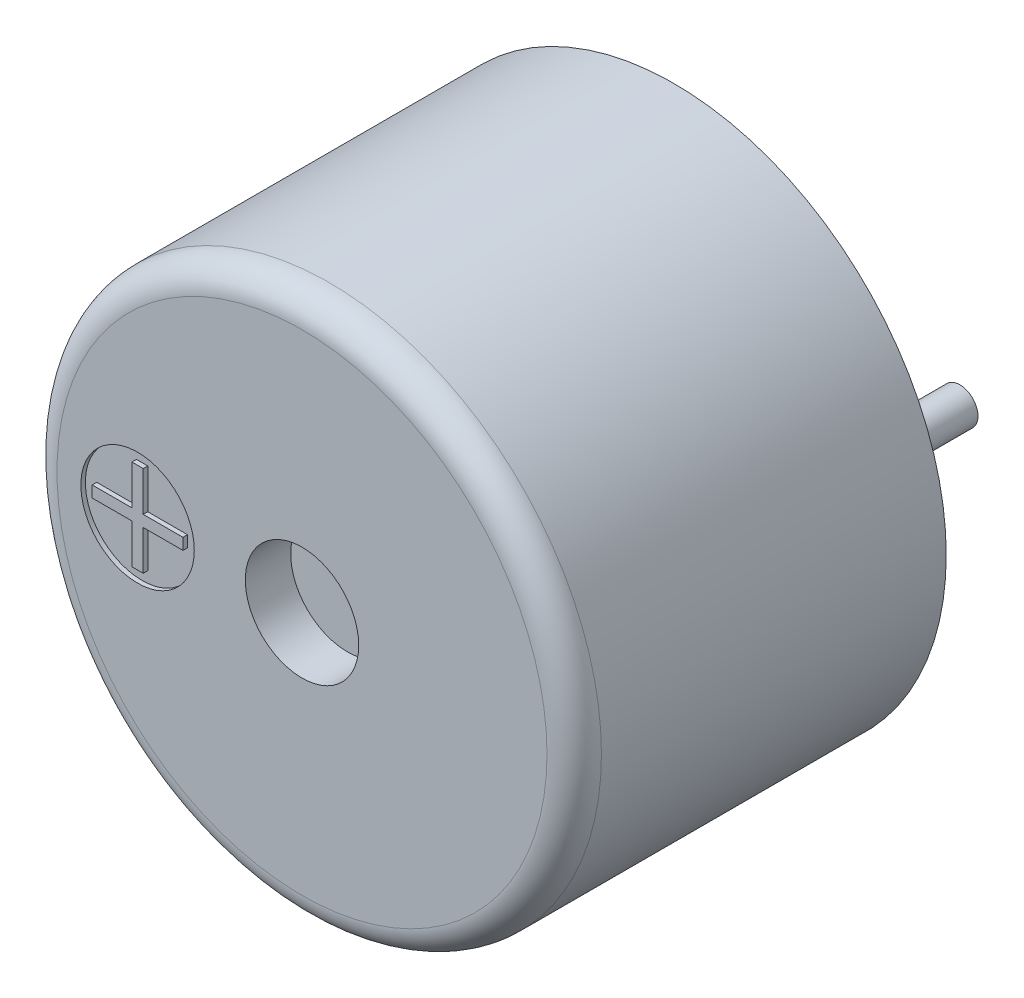
ISO-10303-21;
HEADER;
FILE_DESCRIPTION(('STEP AP214'),'2;1');
FILE_NAME('part.step','',(''),(''),'','','');
FILE_SCHEMA(('AUTOMOTIVE_DESIGN { 1 0 10303 214 1 1 1 1 }'));
ENDSEC;
DATA;
#1=APPLICATION_CONTEXT('core data for automotive mechanical design processes');
#2=APPLICATION_PROTOCOL_DEFINITION('international standard','automotive_design',2000,#1);
#3=PRODUCT_CONTEXT('',#1,'mechanical');
#4=PRODUCT('Part','Part','',(#3));
#5=PRODUCT_RELATED_PRODUCT_CATEGORY('part','',(#4));
#6=PRODUCT_DEFINITION_FORMATION('','',#4);
#7=PRODUCT_DEFINITION_CONTEXT('part definition',#1,'design');
#8=PRODUCT_DEFINITION('design','',#6,#7);
#9=PRODUCT_DEFINITION_SHAPE('','',#8);
#10=(LENGTH_UNIT() NAMED_UNIT(*) SI_UNIT(.MILLI.,.METRE.));
#11=(NAMED_UNIT(*) PLANE_ANGLE_UNIT() SI_UNIT($,.RADIAN.));
#12=(NAMED_UNIT(*) SI_UNIT($,.STERADIAN.) SOLID_ANGLE_UNIT());
#13=UNCERTAINTY_MEASURE_WITH_UNIT(LENGTH_MEASURE(1.E-05),#10,'distance_accuracy_value','');
#14=(GEOMETRIC_REPRESENTATION_CONTEXT(3) GLOBAL_UNCERTAINTY_ASSIGNED_CONTEXT((#13)) GLOBAL_UNIT_ASSIGNED_CONTEXT((#10,
#11,#12)) REPRESENTATION_CONTEXT('',''));
#15=CARTESIAN_POINT('',(0.,0.,0.));
#16=DIRECTION('',(0.,0.,1.));
#17=DIRECTION('',(1.,0.,0.));
#18=AXIS2_PLACEMENT_3D('',#15,#16,#17);
#19=CARTESIAN_POINT('',(0.,0.,8.2));
#20=DIRECTION('',(0.,0.,-1.));
#21=DIRECTION('',(-1.,0.,0.));
#22=AXIS2_PLACEMENT_3D('',#19,#20,#21);
#23=CYLINDRICAL_SURFACE('',#22,6.);
#24=CARTESIAN_POINT('',(0.,0.,7.6));
#25=DIRECTION('',(0.,0.,1.));
#26=DIRECTION('',(1.,0.,0.));
#27=AXIS2_PLACEMENT_3D('',#24,#25,#26);
#28=CIRCLE('',#27,6.);
#29=CARTESIAN_POINT('',(6.,0.,7.6));
#30=VERTEX_POINT('',#29);
#31=EDGE_CURVE('E11',#30,#30,#28,.F.);
#32=ORIENTED_EDGE('',*,*,#31,.T.);
#33=EDGE_LOOP('',(#32));
#34=FACE_BOUND('',#33,.T.);
#35=CARTESIAN_POINT('',(0.,0.,0.));
#36=DIRECTION('',(0.,0.,1.));
#37=DIRECTION('',(1.,0.,0.));
#38=AXIS2_PLACEMENT_3D('',#35,#36,#37);
#39=CIRCLE('',#38,6.);
#40=CARTESIAN_POINT('',(6.,0.,0.));
#41=VERTEX_POINT('',#40);
#42=EDGE_CURVE('E250',#41,#41,#39,.T.);
#43=ORIENTED_EDGE('',*,*,#42,.T.);
#44=EDGE_LOOP('',(#43));
#45=FACE_BOUND('',#44,.T.);
#46=ADVANCED_FACE('F37',(#34,#45),#23,.T.);
#47=CARTESIAN_POINT('',(0.,0.,8.2));
#48=DIRECTION('',(0.,0.,1.));
#49=DIRECTION('',(1.,0.,0.));
#50=AXIS2_PLACEMENT_3D('',#47,#48,#49);
#51=PLANE('',#50);
#52=CARTESIAN_POINT('',(-3.625,0.,8.2));
#53=DIRECTION('',(0.,0.,1.));
#54=DIRECTION('',(1.,0.,0.));
#55=AXIS2_PLACEMENT_3D('',#52,#53,#54);
#56=CIRCLE('',#55,1.25);
#57=CARTESIAN_POINT('',(-2.375,0.,8.2));
#58=VERTEX_POINT('',#57);
#59=EDGE_CURVE('E209',#58,#58,#56,.T.);
#60=ORIENTED_EDGE('',*,*,#59,.F.);
#61=EDGE_LOOP('',(#60));
#62=FACE_BOUND('',#61,.T.);
#63=CARTESIAN_POINT('',(0.,0.,8.2));
#64=DIRECTION('',(0.,0.,1.));
#65=DIRECTION('',(1.,0.,0.));
#66=AXIS2_PLACEMENT_3D('',#63,#64,#65);
#67=CIRCLE('',#66,5.4);
#68=CARTESIAN_POINT('',(5.4,0.,8.2));
#69=VERTEX_POINT('',#68);
#70=EDGE_CURVE('E45',#69,#69,#67,.T.);
#71=ORIENTED_EDGE('',*,*,#70,.T.);
#72=EDGE_LOOP('',(#71));
#73=FACE_BOUND('',#72,.T.);
#74=CARTESIAN_POINT('',(0.,0.,8.2));
#75=DIRECTION('',(0.,0.,1.));
#76=DIRECTION('',(1.,0.,0.));
#77=AXIS2_PLACEMENT_3D('',#74,#75,#76);
#78=CIRCLE('',#77,1.25);
#79=CARTESIAN_POINT('',(1.25,0.,8.2));
#80=VERTEX_POINT('',#79);
#81=EDGE_CURVE('E244',#80,#80,#78,.T.);
#82=ORIENTED_EDGE('',*,*,#81,.F.);
#83=EDGE_LOOP('',(#82));
#84=FACE_BOUND('',#83,.T.);
#85=ADVANCED_FACE('F257',(#62,#73,#84),#51,.T.);
#86=CARTESIAN_POINT('',(0.,0.,0.));
#87=DIRECTION('',(0.,0.,1.));
#88=DIRECTION('',(1.,0.,0.));
#89=AXIS2_PLACEMENT_3D('',#86,#87,#88);
#90=PLANE('',#89);
#91=CARTESIAN_POINT('',(-3.3,0.,0.));
#92=DIRECTION('',(0.,0.,1.));
#93=DIRECTION('',(-1.,0.,0.));
#94=AXIS2_PLACEMENT_3D('',#91,#92,#93);
#95=CIRCLE('',#94,0.4);
#96=CARTESIAN_POINT('',(-3.7,0.,0.));
#97=VERTEX_POINT('',#96);
#98=EDGE_CURVE('E232',#97,#97,#95,.T.);
#99=ORIENTED_EDGE('',*,*,#98,.T.);
#100=EDGE_LOOP('',(#99));
#101=FACE_BOUND('',#100,.T.);
#102=CARTESIAN_POINT('',(3.3,0.,0.));
#103=DIRECTION('',(0.,0.,1.));
#104=DIRECTION('',(1.,0.,0.));
#105=AXIS2_PLACEMENT_3D('',#102,#103,#104);
#106=CIRCLE('',#105,0.4);
#107=CARTESIAN_POINT('',(3.7,0.,0.));
#108=VERTEX_POINT('',#107);
#109=EDGE_CURVE('E238',#108,#108,#106,.T.);
#110=ORIENTED_EDGE('',*,*,#109,.T.);
#111=EDGE_LOOP('',(#110));
#112=FACE_BOUND('',#111,.T.);
#113=ORIENTED_EDGE('',*,*,#42,.F.);
#114=EDGE_LOOP('',(#113));
#115=FACE_BOUND('',#114,.T.);
#116=ADVANCED_FACE('F279',(#101,#112,#115),#90,.F.);
#117=CARTESIAN_POINT('',(0.,0.,7.2));
#118=DIRECTION('',(0.,0.,1.));
#119=DIRECTION('',(1.,0.,0.));
#120=AXIS2_PLACEMENT_3D('',#117,#118,#119);
#121=CYLINDRICAL_SURFACE('',#120,1.25);
#122=CARTESIAN_POINT('',(0.,0.,7.2));
#123=DIRECTION('',(0.,0.,1.));
#124=DIRECTION('',(1.,0.,0.));
#125=AXIS2_PLACEMENT_3D('',#122,#123,#124);
#126=CIRCLE('',#125,1.25);
#127=CARTESIAN_POINT('',(1.25,0.,7.2));
#128=VERTEX_POINT('',#127);
#129=EDGE_CURVE('E247',#128,#128,#126,.T.);
#130=ORIENTED_EDGE('',*,*,#129,.F.);
#131=EDGE_LOOP('',(#130));
#132=FACE_BOUND('',#131,.T.);
#133=ORIENTED_EDGE('',*,*,#81,.T.);
#134=EDGE_LOOP('',(#133));
#135=FACE_BOUND('',#134,.T.);
#136=ADVANCED_FACE('F286',(#132,#135),#121,.F.);
#137=CARTESIAN_POINT('',(0.,0.,7.2));
#138=DIRECTION('',(0.,0.,1.));
#139=DIRECTION('',(1.,0.,0.));
#140=AXIS2_PLACEMENT_3D('',#137,#138,#139);
#141=PLANE('',#140);
#142=ORIENTED_EDGE('',*,*,#129,.T.);
#143=EDGE_LOOP('',(#142));
#144=FACE_BOUND('',#143,.T.);
#145=ADVANCED_FACE('F291',(#144),#141,.T.);
#146=CARTESIAN_POINT('',(3.3,0.,-3.));
#147=DIRECTION('',(0.,0.,1.));
#148=DIRECTION('',(1.,0.,0.));
#149=AXIS2_PLACEMENT_3D('',#146,#147,#148);
#150=CYLINDRICAL_SURFACE('',#149,0.4);
#151=CARTESIAN_POINT('',(3.3,0.,-3.));
#152=DIRECTION('',(0.,0.,1.));
#153=DIRECTION('',(1.,0.,0.));
#154=AXIS2_PLACEMENT_3D('',#151,#152,#153);
#155=CIRCLE('',#154,0.4);
#156=CARTESIAN_POINT('',(3.7,0.,-3.));
#157=VERTEX_POINT('',#156);
#158=EDGE_CURVE('E241',#157,#157,#155,.T.);
#159=ORIENTED_EDGE('',*,*,#158,.T.);
#160=EDGE_LOOP('',(#159));
#161=FACE_BOUND('',#160,.T.);
#162=ORIENTED_EDGE('',*,*,#109,.F.);
#163=EDGE_LOOP('',(#162));
#164=FACE_BOUND('',#163,.T.);
#165=ADVANCED_FACE('F295',(#161,#164),#150,.T.);
#166=CARTESIAN_POINT('',(3.3,0.,-3.));
#167=DIRECTION('',(0.,0.,1.));
#168=DIRECTION('',(1.,0.,0.));
#169=AXIS2_PLACEMENT_3D('',#166,#167,#168);
#170=PLANE('',#169);
#171=ORIENTED_EDGE('',*,*,#158,.F.);
#172=EDGE_LOOP('',(#171));
#173=FACE_BOUND('',#172,.T.);
#174=ADVANCED_FACE('F299',(#173),#170,.F.);
#175=CARTESIAN_POINT('',(-3.3,0.,-3.));
#176=DIRECTION('',(0.,0.,1.));
#177=DIRECTION('',(1.,0.,0.));
#178=AXIS2_PLACEMENT_3D('',#175,#176,#177);
#179=CYLINDRICAL_SURFACE('',#178,0.4);
#180=CARTESIAN_POINT('',(-3.3,0.,-3.));
#181=DIRECTION('',(0.,0.,1.));
#182=DIRECTION('',(-1.,0.,0.));
#183=AXIS2_PLACEMENT_3D('',#180,#181,#182);
#184=CIRCLE('',#183,0.4);
#185=CARTESIAN_POINT('',(-3.7,0.,-3.));
#186=VERTEX_POINT('',#185);
#187=EDGE_CURVE('E235',#186,#186,#184,.T.);
#188=ORIENTED_EDGE('',*,*,#187,.T.);
#189=EDGE_LOOP('',(#188));
#190=FACE_BOUND('',#189,.T.);
#191=ORIENTED_EDGE('',*,*,#98,.F.);
#192=EDGE_LOOP('',(#191));
#193=FACE_BOUND('',#192,.T.);
#194=ADVANCED_FACE('F270',(#190,#193),#179,.T.);
#195=CARTESIAN_POINT('',(-3.3,0.,-3.));
#196=DIRECTION('',(0.,0.,-1.));
#197=DIRECTION('',(-1.,0.,0.));
#198=AXIS2_PLACEMENT_3D('',#195,#196,#197);
#199=PLANE('',#198);
#200=ORIENTED_EDGE('',*,*,#187,.F.);
#201=EDGE_LOOP('',(#200));
#202=FACE_BOUND('',#201,.T.);
#203=ADVANCED_FACE('F262',(#202),#199,.T.);
#204=CARTESIAN_POINT('',(0.,0.,7.6));
#205=DIRECTION('',(0.,0.,1.));
#206=DIRECTION('',(1.,0.,0.));
#207=AXIS2_PLACEMENT_3D('',#204,#205,#206);
#208=TOROIDAL_SURFACE('',#207,5.4,0.6);
#209=ORIENTED_EDGE('',*,*,#31,.F.);
#210=EDGE_LOOP('',(#209));
#211=FACE_BOUND('',#210,.T.);
#212=ORIENTED_EDGE('',*,*,#70,.F.);
#213=EDGE_LOOP('',(#212));
#214=FACE_BOUND('',#213,.T.);
#215=ADVANCED_FACE('F39',(#211,#214),#208,.T.);
#216=CARTESIAN_POINT('',(-3.625,0.,8.1));
#217=DIRECTION('',(0.,0.,1.));
#218=DIRECTION('',(1.,0.,0.));
#219=AXIS2_PLACEMENT_3D('',#216,#217,#218);
#220=CYLINDRICAL_SURFACE('',#219,1.25);
#221=CARTESIAN_POINT('',(-3.625,0.,8.1));
#222=DIRECTION('',(0.,0.,1.));
#223=DIRECTION('',(1.,0.,0.));
#224=AXIS2_PLACEMENT_3D('',#221,#222,#223);
#225=CIRCLE('',#224,1.25);
#226=CARTESIAN_POINT('',(-2.375,0.,8.1));
#227=VERTEX_POINT('',#226);
#228=EDGE_CURVE('E229',#227,#227,#225,.T.);
#229=ORIENTED_EDGE('',*,*,#228,.F.);
#230=EDGE_LOOP('',(#229));
#231=FACE_BOUND('',#230,.T.);
#232=ORIENTED_EDGE('',*,*,#59,.T.);
#233=EDGE_LOOP('',(#232));
#234=FACE_BOUND('',#233,.T.);
#235=ADVANCED_FACE('F261',(#231,#234),#220,.F.);
#236=CARTESIAN_POINT('',(-3.625,0.,8.1));
#237=DIRECTION('',(0.,0.,1.));
#238=DIRECTION('',(1.,0.,0.));
#239=AXIS2_PLACEMENT_3D('',#236,#237,#238);
#240=PLANE('',#239);
#241=DIRECTION('',(0.,1.,0.));
#242=VECTOR('',#241,1.);
#243=CARTESIAN_POINT('',(-2.625,-0.125,8.1));
#244=LINE('',#243,#242);
#245=CARTESIAN_POINT('',(-2.625,-0.125,8.1));
#246=VERTEX_POINT('',#245);
#247=CARTESIAN_POINT('',(-2.625,0.125,8.1));
#248=VERTEX_POINT('',#247);
#249=EDGE_CURVE('E138',#246,#248,#244,.T.);
#250=ORIENTED_EDGE('',*,*,#249,.F.);
#251=DIRECTION('',(1.,0.,0.));
#252=VECTOR('',#251,1.);
#253=CARTESIAN_POINT('',(-2.625,-0.125,8.1));
#254=LINE('',#253,#252);
#255=CARTESIAN_POINT('',(-3.5,-0.125,8.1));
#256=VERTEX_POINT('',#255);
#257=EDGE_CURVE('E177',#256,#246,#254,.T.);
#258=ORIENTED_EDGE('',*,*,#257,.F.);
#259=DIRECTION('',(0.,1.,0.));
#260=VECTOR('',#259,1.);
#261=CARTESIAN_POINT('',(-3.5,-1.,8.1));
#262=LINE('',#261,#260);
#263=CARTESIAN_POINT('',(-3.5,-1.,8.1));
#264=VERTEX_POINT('',#263);
#265=EDGE_CURVE('E174',#264,#256,#262,.T.);
#266=ORIENTED_EDGE('',*,*,#265,.F.);
#267=DIRECTION('',(1.,0.,0.));
#268=VECTOR('',#267,1.);
#269=CARTESIAN_POINT('',(-3.75,-1.,8.1));
#270=LINE('',#269,#268);
#271=CARTESIAN_POINT('',(-3.75,-1.,8.1));
#272=VERTEX_POINT('',#271);
#273=EDGE_CURVE('E171',#272,#264,#270,.T.);
#274=ORIENTED_EDGE('',*,*,#273,.F.);
#275=DIRECTION('',(0.,-1.,0.));
#276=VECTOR('',#275,1.);
#277=CARTESIAN_POINT('',(-3.75,-1.,8.1));
#278=LINE('',#277,#276);
#279=CARTESIAN_POINT('',(-3.75,-0.125,8.1));
#280=VERTEX_POINT('',#279);
#281=EDGE_CURVE('E168',#280,#272,#278,.T.);
#282=ORIENTED_EDGE('',*,*,#281,.F.);
#283=DIRECTION('',(1.,0.,0.));
#284=VECTOR('',#283,1.);
#285=CARTESIAN_POINT('',(-4.625,-0.125,8.1));
#286=LINE('',#285,#284);
#287=CARTESIAN_POINT('',(-4.625,-0.125,8.1));
#288=VERTEX_POINT('',#287);
#289=EDGE_CURVE('E165',#288,#280,#286,.T.);
#290=ORIENTED_EDGE('',*,*,#289,.F.);
#291=DIRECTION('',(0.,-1.,0.));
#292=VECTOR('',#291,1.);
#293=CARTESIAN_POINT('',(-4.625,-0.125,8.1));
#294=LINE('',#293,#292);
#295=CARTESIAN_POINT('',(-4.625,0.125,8.1));
#296=VERTEX_POINT('',#295);
#297=EDGE_CURVE('E162',#296,#288,#294,.T.);
#298=ORIENTED_EDGE('',*,*,#297,.F.);
#299=DIRECTION('',(-1.,0.,0.));
#300=VECTOR('',#299,1.);
#301=CARTESIAN_POINT('',(-4.625,0.125,8.1));
#302=LINE('',#301,#300);
#303=CARTESIAN_POINT('',(-3.75,0.124999999999999,8.1));
#304=VERTEX_POINT('',#303);
#305=EDGE_CURVE('E159',#304,#296,#302,.T.);
#306=ORIENTED_EDGE('',*,*,#305,.F.);
#307=DIRECTION('',(0.,-1.,0.));
#308=VECTOR('',#307,1.);
#309=CARTESIAN_POINT('',(-3.75,1.,8.1));
#310=LINE('',#309,#308);
#311=CARTESIAN_POINT('',(-3.75,1.,8.1));
#312=VERTEX_POINT('',#311);
#313=EDGE_CURVE('E156',#312,#304,#310,.T.);
#314=ORIENTED_EDGE('',*,*,#313,.F.);
#315=DIRECTION('',(-1.,0.,0.));
#316=VECTOR('',#315,1.);
#317=CARTESIAN_POINT('',(-3.75,1.,8.1));
#318=LINE('',#317,#316);
#319=CARTESIAN_POINT('',(-3.5,1.,8.1));
#320=VERTEX_POINT('',#319);
#321=EDGE_CURVE('E60',#320,#312,#318,.T.);
#322=ORIENTED_EDGE('',*,*,#321,.F.);
#323=DIRECTION('',(0.,1.,0.));
#324=VECTOR('',#323,1.);
#325=CARTESIAN_POINT('',(-3.5,1.,8.1));
#326=LINE('',#325,#324);
#327=CARTESIAN_POINT('',(-3.5,0.124999999999999,8.1));
#328=VERTEX_POINT('',#327);
#329=EDGE_CURVE('E130',#328,#320,#326,.T.);
#330=ORIENTED_EDGE('',*,*,#329,.F.);
#331=DIRECTION('',(-1.,0.,0.));
#332=VECTOR('',#331,1.);
#333=CARTESIAN_POINT('',(-2.625,0.125,8.1));
#334=LINE('',#333,#332);
#335=EDGE_CURVE('E144',#248,#328,#334,.T.);
#336=ORIENTED_EDGE('',*,*,#335,.F.);
#337=EDGE_LOOP('',(#250,#258,#266,#274,#282,#290,#298,#306,#314,#322,#330,#336));
#338=FACE_BOUND('',#337,.T.);
#339=ORIENTED_EDGE('',*,*,#228,.T.);
#340=EDGE_LOOP('',(#339));
#341=FACE_BOUND('',#340,.T.);
#342=ADVANCED_FACE('F142',(#338,#341),#240,.T.);
#343=CARTESIAN_POINT('',(-2.625,0.125,8.1));
#344=DIRECTION('',(0.,1.,0.));
#345=DIRECTION('',(-1.,0.,0.));
#346=AXIS2_PLACEMENT_3D('',#343,#344,#345);
#347=PLANE('',#346);
#348=DIRECTION('',(-1.,0.,0.));
#349=VECTOR('',#348,1.);
#350=CARTESIAN_POINT('',(-2.625,0.125,8.2));
#351=LINE('',#350,#349);
#352=CARTESIAN_POINT('',(-2.625,0.125,8.2));
#353=VERTEX_POINT('',#352);
#354=CARTESIAN_POINT('',(-3.5,0.124999999999999,8.2));
#355=VERTEX_POINT('',#354);
#356=EDGE_CURVE('E181',#353,#355,#351,.T.);
#357=ORIENTED_EDGE('',*,*,#356,.F.);
#358=DIRECTION('',(0.,0.,1.));
#359=VECTOR('',#358,1.);
#360=CARTESIAN_POINT('',(-2.625,0.125,8.1));
#361=LINE('',#360,#359);
#362=EDGE_CURVE('E148',#248,#353,#361,.T.);
#363=ORIENTED_EDGE('',*,*,#362,.F.);
#364=ORIENTED_EDGE('',*,*,#335,.T.);
#365=DIRECTION('',(0.,0.,1.));
#366=VECTOR('',#365,1.);
#367=CARTESIAN_POINT('',(-3.5,0.124999999999999,8.1));
#368=LINE('',#367,#366);
#369=EDGE_CURVE('E128',#328,#355,#368,.T.);
#370=ORIENTED_EDGE('',*,*,#369,.T.);
#371=EDGE_LOOP('',(#357,#363,#364,#370));
#372=FACE_BOUND('',#371,.T.);
#373=ADVANCED_FACE('F147',(#372),#347,.T.);
#374=CARTESIAN_POINT('',(-2.625,-0.125,8.1));
#375=DIRECTION('',(1.,0.,0.));
#376=DIRECTION('',(0.,0.,-1.));
#377=AXIS2_PLACEMENT_3D('',#374,#375,#376);
#378=PLANE('',#377);
#379=DIRECTION('',(0.,1.,0.));
#380=VECTOR('',#379,1.);
#381=CARTESIAN_POINT('',(-2.625,-0.125,8.2));
#382=LINE('',#381,#380);
#383=CARTESIAN_POINT('',(-2.625,-0.125,8.2));
#384=VERTEX_POINT('',#383);
#385=EDGE_CURVE('E149',#384,#353,#382,.T.);
#386=ORIENTED_EDGE('',*,*,#385,.F.);
#387=DIRECTION('',(0.,0.,1.));
#388=VECTOR('',#387,1.);
#389=CARTESIAN_POINT('',(-2.625,-0.125,8.1));
#390=LINE('',#389,#388);
#391=EDGE_CURVE('E210',#246,#384,#390,.T.);
#392=ORIENTED_EDGE('',*,*,#391,.F.);
#393=ORIENTED_EDGE('',*,*,#249,.T.);
#394=ORIENTED_EDGE('',*,*,#362,.T.);
#395=EDGE_LOOP('',(#386,#392,#393,#394));
#396=FACE_BOUND('',#395,.T.);
#397=ADVANCED_FACE('F311',(#396),#378,.T.);
#398=CARTESIAN_POINT('',(-2.625,-0.125,8.1));
#399=DIRECTION('',(0.,-1.,0.));
#400=DIRECTION('',(1.,0.,0.));
#401=AXIS2_PLACEMENT_3D('',#398,#399,#400);
#402=PLANE('',#401);
#403=DIRECTION('',(1.,0.,0.));
#404=VECTOR('',#403,1.);
#405=CARTESIAN_POINT('',(-2.625,-0.125,8.2));
#406=LINE('',#405,#404);
#407=CARTESIAN_POINT('',(-3.5,-0.125,8.2));
#408=VERTEX_POINT('',#407);
#409=EDGE_CURVE('E152',#408,#384,#406,.T.);
#410=ORIENTED_EDGE('',*,*,#409,.F.);
#411=DIRECTION('',(0.,0.,1.));
#412=VECTOR('',#411,1.);
#413=CARTESIAN_POINT('',(-3.5,-0.125,8.1));
#414=LINE('',#413,#412);
#415=EDGE_CURVE('E212',#256,#408,#414,.T.);
#416=ORIENTED_EDGE('',*,*,#415,.F.);
#417=ORIENTED_EDGE('',*,*,#257,.T.);
#418=ORIENTED_EDGE('',*,*,#391,.T.);
#419=EDGE_LOOP('',(#410,#416,#417,#418));
#420=FACE_BOUND('',#419,.T.);
#421=ADVANCED_FACE('F344',(#420),#402,.T.);
#422=CARTESIAN_POINT('',(-3.5,-1.,8.1));
#423=DIRECTION('',(1.,0.,0.));
#424=DIRECTION('',(0.,1.,0.));
#425=AXIS2_PLACEMENT_3D('',#422,#423,#424);
#426=PLANE('',#425);
#427=DIRECTION('',(0.,1.,0.));
#428=VECTOR('',#427,1.);
#429=CARTESIAN_POINT('',(-3.5,-1.,8.2));
#430=LINE('',#429,#428);
#431=CARTESIAN_POINT('',(-3.5,-1.,8.2));
#432=VERTEX_POINT('',#431);
#433=EDGE_CURVE('E203',#432,#408,#430,.T.);
#434=ORIENTED_EDGE('',*,*,#433,.F.);
#435=DIRECTION('',(0.,0.,1.));
#436=VECTOR('',#435,1.);
#437=CARTESIAN_POINT('',(-3.5,-1.,8.1));
#438=LINE('',#437,#436);
#439=EDGE_CURVE('E214',#264,#432,#438,.T.);
#440=ORIENTED_EDGE('',*,*,#439,.F.);
#441=ORIENTED_EDGE('',*,*,#265,.T.);
#442=ORIENTED_EDGE('',*,*,#415,.T.);
#443=EDGE_LOOP('',(#434,#440,#441,#442));
#444=FACE_BOUND('',#443,.T.);
#445=ADVANCED_FACE('F340',(#444),#426,.T.);
#446=CARTESIAN_POINT('',(-3.75,-1.,8.1));
#447=DIRECTION('',(0.,-1.,0.));
#448=DIRECTION('',(0.,0.,-1.));
#449=AXIS2_PLACEMENT_3D('',#446,#447,#448);
#450=PLANE('',#449);
#451=DIRECTION('',(1.,0.,0.));
#452=VECTOR('',#451,1.);
#453=CARTESIAN_POINT('',(-3.75,-1.,8.2));
#454=LINE('',#453,#452);
#455=CARTESIAN_POINT('',(-3.75,-1.,8.2));
#456=VERTEX_POINT('',#455);
#457=EDGE_CURVE('E200',#456,#432,#454,.T.);
#458=ORIENTED_EDGE('',*,*,#457,.F.);
#459=DIRECTION('',(0.,0.,1.));
#460=VECTOR('',#459,1.);
#461=CARTESIAN_POINT('',(-3.75,-1.,8.1));
#462=LINE('',#461,#460);
#463=EDGE_CURVE('E216',#272,#456,#462,.T.);
#464=ORIENTED_EDGE('',*,*,#463,.F.);
#465=ORIENTED_EDGE('',*,*,#273,.T.);
#466=ORIENTED_EDGE('',*,*,#439,.T.);
#467=EDGE_LOOP('',(#458,#464,#465,#466));
#468=FACE_BOUND('',#467,.T.);
#469=ADVANCED_FACE('F336',(#468),#450,.T.);
#470=CARTESIAN_POINT('',(-3.75,-1.,8.1));
#471=DIRECTION('',(-1.,0.,0.));
#472=DIRECTION('',(0.,-1.,0.));
#473=AXIS2_PLACEMENT_3D('',#470,#471,#472);
#474=PLANE('',#473);
#475=DIRECTION('',(0.,-1.,0.));
#476=VECTOR('',#475,1.);
#477=CARTESIAN_POINT('',(-3.75,-1.,8.2));
#478=LINE('',#477,#476);
#479=CARTESIAN_POINT('',(-3.75,-0.125,8.2));
#480=VERTEX_POINT('',#479);
#481=EDGE_CURVE('E197',#480,#456,#478,.T.);
#482=ORIENTED_EDGE('',*,*,#481,.F.);
#483=DIRECTION('',(0.,0.,1.));
#484=VECTOR('',#483,1.);
#485=CARTESIAN_POINT('',(-3.75,-0.125,8.1));
#486=LINE('',#485,#484);
#487=EDGE_CURVE('E218',#280,#480,#486,.T.);
#488=ORIENTED_EDGE('',*,*,#487,.F.);
#489=ORIENTED_EDGE('',*,*,#281,.T.);
#490=ORIENTED_EDGE('',*,*,#463,.T.);
#491=EDGE_LOOP('',(#482,#488,#489,#490));
#492=FACE_BOUND('',#491,.T.);
#493=ADVANCED_FACE('F332',(#492),#474,.T.);
#494=CARTESIAN_POINT('',(-4.625,-0.125,8.1));
#495=DIRECTION('',(0.,-1.,0.));
#496=DIRECTION('',(1.,0.,0.));
#497=AXIS2_PLACEMENT_3D('',#494,#495,#496);
#498=PLANE('',#497);
#499=DIRECTION('',(1.,0.,0.));
#500=VECTOR('',#499,1.);
#501=CARTESIAN_POINT('',(-4.625,-0.125,8.2));
#502=LINE('',#501,#500);
#503=CARTESIAN_POINT('',(-4.625,-0.125,8.2));
#504=VERTEX_POINT('',#503);
#505=EDGE_CURVE('E194',#504,#480,#502,.T.);
#506=ORIENTED_EDGE('',*,*,#505,.F.);
#507=DIRECTION('',(0.,0.,1.));
#508=VECTOR('',#507,1.);
#509=CARTESIAN_POINT('',(-4.625,-0.125,8.1));
#510=LINE('',#509,#508);
#511=EDGE_CURVE('E220',#288,#504,#510,.T.);
#512=ORIENTED_EDGE('',*,*,#511,.F.);
#513=ORIENTED_EDGE('',*,*,#289,.T.);
#514=ORIENTED_EDGE('',*,*,#487,.T.);
#515=EDGE_LOOP('',(#506,#512,#513,#514));
#516=FACE_BOUND('',#515,.T.);
#517=ADVANCED_FACE('F328',(#516),#498,.T.);
#518=CARTESIAN_POINT('',(-4.625,-0.125,8.1));
#519=DIRECTION('',(-1.,0.,0.));
#520=DIRECTION('',(0.,0.,1.));
#521=AXIS2_PLACEMENT_3D('',#518,#519,#520);
#522=PLANE('',#521);
#523=DIRECTION('',(0.,-1.,0.));
#524=VECTOR('',#523,1.);
#525=CARTESIAN_POINT('',(-4.625,-0.125,8.2));
#526=LINE('',#525,#524);
#527=CARTESIAN_POINT('',(-4.625,0.125,8.2));
#528=VERTEX_POINT('',#527);
#529=EDGE_CURVE('E191',#528,#504,#526,.T.);
#530=ORIENTED_EDGE('',*,*,#529,.F.);
#531=DIRECTION('',(0.,0.,1.));
#532=VECTOR('',#531,1.);
#533=CARTESIAN_POINT('',(-4.625,0.125,8.1));
#534=LINE('',#533,#532);
#535=EDGE_CURVE('E222',#296,#528,#534,.T.);
#536=ORIENTED_EDGE('',*,*,#535,.F.);
#537=ORIENTED_EDGE('',*,*,#297,.T.);
#538=ORIENTED_EDGE('',*,*,#511,.T.);
#539=EDGE_LOOP('',(#530,#536,#537,#538));
#540=FACE_BOUND('',#539,.T.);
#541=ADVANCED_FACE('F324',(#540),#522,.T.);
#542=CARTESIAN_POINT('',(-4.625,0.125,8.1));
#543=DIRECTION('',(0.,1.,0.));
#544=DIRECTION('',(-1.,0.,0.));
#545=AXIS2_PLACEMENT_3D('',#542,#543,#544);
#546=PLANE('',#545);
#547=DIRECTION('',(-1.,0.,0.));
#548=VECTOR('',#547,1.);
#549=CARTESIAN_POINT('',(-4.625,0.125,8.2));
#550=LINE('',#549,#548);
#551=CARTESIAN_POINT('',(-3.75,0.124999999999999,8.2));
#552=VERTEX_POINT('',#551);
#553=EDGE_CURVE('E188',#552,#528,#550,.T.);
#554=ORIENTED_EDGE('',*,*,#553,.F.);
#555=DIRECTION('',(0.,0.,1.));
#556=VECTOR('',#555,1.);
#557=CARTESIAN_POINT('',(-3.75,0.124999999999999,8.1));
#558=LINE('',#557,#556);
#559=EDGE_CURVE('E224',#304,#552,#558,.T.);
#560=ORIENTED_EDGE('',*,*,#559,.F.);
#561=ORIENTED_EDGE('',*,*,#305,.T.);
#562=ORIENTED_EDGE('',*,*,#535,.T.);
#563=EDGE_LOOP('',(#554,#560,#561,#562));
#564=FACE_BOUND('',#563,.T.);
#565=ADVANCED_FACE('F320',(#564),#546,.T.);
#566=CARTESIAN_POINT('',(-3.75,1.,8.1));
#567=DIRECTION('',(-1.,0.,0.));
#568=DIRECTION('',(0.,-1.,0.));
#569=AXIS2_PLACEMENT_3D('',#566,#567,#568);
#570=PLANE('',#569);
#571=DIRECTION('',(0.,-1.,0.));
#572=VECTOR('',#571,1.);
#573=CARTESIAN_POINT('',(-3.75,1.,8.2));
#574=LINE('',#573,#572);
#575=CARTESIAN_POINT('',(-3.75,1.,8.2));
#576=VERTEX_POINT('',#575);
#577=EDGE_CURVE('E185',#576,#552,#574,.T.);
#578=ORIENTED_EDGE('',*,*,#577,.F.);
#579=DIRECTION('',(0.,0.,1.));
#580=VECTOR('',#579,1.);
#581=CARTESIAN_POINT('',(-3.75,1.,8.1));
#582=LINE('',#581,#580);
#583=EDGE_CURVE('E226',#312,#576,#582,.T.);
#584=ORIENTED_EDGE('',*,*,#583,.F.);
#585=ORIENTED_EDGE('',*,*,#313,.T.);
#586=ORIENTED_EDGE('',*,*,#559,.T.);
#587=EDGE_LOOP('',(#578,#584,#585,#586));
#588=FACE_BOUND('',#587,.T.);
#589=ADVANCED_FACE('F317',(#588),#570,.T.);
#590=CARTESIAN_POINT('',(-3.75,1.,8.1));
#591=DIRECTION('',(0.,1.,0.));
#592=DIRECTION('',(0.,0.,1.));
#593=AXIS2_PLACEMENT_3D('',#590,#591,#592);
#594=PLANE('',#593);
#595=DIRECTION('',(-1.,0.,0.));
#596=VECTOR('',#595,1.);
#597=CARTESIAN_POINT('',(-3.75,1.,8.2));
#598=LINE('',#597,#596);
#599=CARTESIAN_POINT('',(-3.5,1.,8.2));
#600=VERTEX_POINT('',#599);
#601=EDGE_CURVE('E52',#600,#576,#598,.T.);
#602=ORIENTED_EDGE('',*,*,#601,.F.);
#603=DIRECTION('',(0.,0.,1.));
#604=VECTOR('',#603,1.);
#605=CARTESIAN_POINT('',(-3.5,1.,8.1));
#606=LINE('',#605,#604);
#607=EDGE_CURVE('E137',#320,#600,#606,.T.);
#608=ORIENTED_EDGE('',*,*,#607,.F.);
#609=ORIENTED_EDGE('',*,*,#321,.T.);
#610=ORIENTED_EDGE('',*,*,#583,.T.);
#611=EDGE_LOOP('',(#602,#608,#609,#610));
#612=FACE_BOUND('',#611,.T.);
#613=ADVANCED_FACE('F314',(#612),#594,.T.);
#614=CARTESIAN_POINT('',(-3.5,1.,8.1));
#615=DIRECTION('',(1.,0.,0.));
#616=DIRECTION('',(0.,1.,0.));
#617=AXIS2_PLACEMENT_3D('',#614,#615,#616);
#618=PLANE('',#617);
#619=DIRECTION('',(0.,1.,0.));
#620=VECTOR('',#619,1.);
#621=CARTESIAN_POINT('',(-3.5,1.,8.2));
#622=LINE('',#621,#620);
#623=EDGE_CURVE('E132',#355,#600,#622,.T.);
#624=ORIENTED_EDGE('',*,*,#623,.F.);
#625=ORIENTED_EDGE('',*,*,#369,.F.);
#626=ORIENTED_EDGE('',*,*,#329,.T.);
#627=ORIENTED_EDGE('',*,*,#607,.T.);
#628=EDGE_LOOP('',(#624,#625,#626,#627));
#629=FACE_BOUND('',#628,.T.);
#630=ADVANCED_FACE('F129',(#629),#618,.T.);
#631=ORIENTED_EDGE('',*,*,#385,.T.);
#632=ORIENTED_EDGE('',*,*,#356,.T.);
#633=ORIENTED_EDGE('',*,*,#623,.T.);
#634=ORIENTED_EDGE('',*,*,#601,.T.);
#635=ORIENTED_EDGE('',*,*,#577,.T.);
#636=ORIENTED_EDGE('',*,*,#553,.T.);
#637=ORIENTED_EDGE('',*,*,#529,.T.);
#638=ORIENTED_EDGE('',*,*,#505,.T.);
#639=ORIENTED_EDGE('',*,*,#481,.T.);
#640=ORIENTED_EDGE('',*,*,#457,.T.);
#641=ORIENTED_EDGE('',*,*,#433,.T.);
#642=ORIENTED_EDGE('',*,*,#409,.T.);
#643=EDGE_LOOP('',(#631,#632,#633,#634,#635,#636,#637,#638,#639,#640,#641,#642));
#644=FACE_BOUND('',#643,.T.);
#645=ADVANCED_FACE('F282',(#644),#51,.T.);
#646=CLOSED_SHELL('',(#46,#85,#116,#136,#145,#165,#174,#194,#203,#215,#235,#342,#373,#397,#421,
#445,#469,#493,#517,#541,#565,#589,#613,#630,#645));
#647=MANIFOLD_SOLID_BREP('B2',#646);
#648=ADVANCED_BREP_SHAPE_REPRESENTATION('',(#18,#647),#14);
#649=SHAPE_DEFINITION_REPRESENTATION(#9,#648);
ENDSEC;
END-ISO-10303-21;
